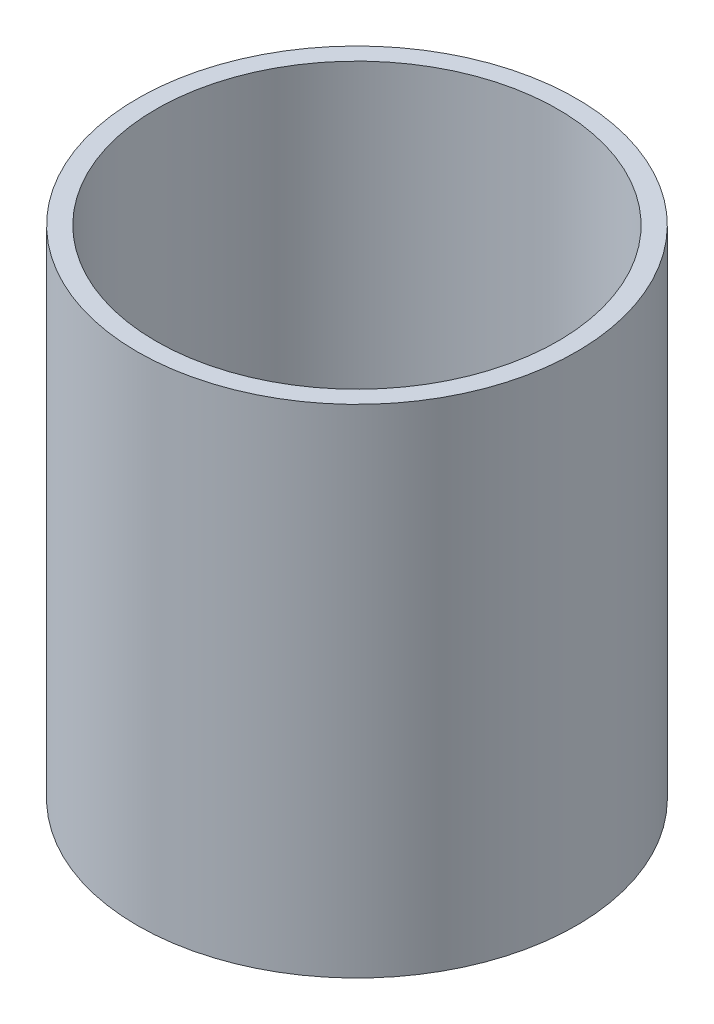
ISO-10303-21;
HEADER;
FILE_DESCRIPTION(('STEP AP214'),'2;1');
FILE_NAME('part.step','',(''),(''),'','','');
FILE_SCHEMA(('AUTOMOTIVE_DESIGN { 1 0 10303 214 1 1 1 1 }'));
ENDSEC;
DATA;
#1=APPLICATION_CONTEXT('core data for automotive mechanical design processes');
#2=APPLICATION_PROTOCOL_DEFINITION('international standard','automotive_design',2000,#1);
#3=PRODUCT_CONTEXT('',#1,'mechanical');
#4=PRODUCT('Part','Part','',(#3));
#5=PRODUCT_RELATED_PRODUCT_CATEGORY('part','',(#4));
#6=PRODUCT_DEFINITION_FORMATION('','',#4);
#7=PRODUCT_DEFINITION_CONTEXT('part definition',#1,'design');
#8=PRODUCT_DEFINITION('design','',#6,#7);
#9=PRODUCT_DEFINITION_SHAPE('','',#8);
#10=(LENGTH_UNIT() NAMED_UNIT(*) SI_UNIT(.MILLI.,.METRE.));
#11=(NAMED_UNIT(*) PLANE_ANGLE_UNIT() SI_UNIT($,.RADIAN.));
#12=(NAMED_UNIT(*) SI_UNIT($,.STERADIAN.) SOLID_ANGLE_UNIT());
#13=UNCERTAINTY_MEASURE_WITH_UNIT(LENGTH_MEASURE(1.E-05),#10,'distance_accuracy_value','');
#14=(GEOMETRIC_REPRESENTATION_CONTEXT(3) GLOBAL_UNCERTAINTY_ASSIGNED_CONTEXT((#13)) GLOBAL_UNIT_ASSIGNED_CONTEXT((#10,
#11,#12)) REPRESENTATION_CONTEXT('',''));
#15=CARTESIAN_POINT('',(0.,0.,0.));
#16=DIRECTION('',(0.,0.,1.));
#17=DIRECTION('',(1.,0.,0.));
#18=AXIS2_PLACEMENT_3D('',#15,#16,#17);
#19=CARTESIAN_POINT('',(0.,190.5,0.));
#20=DIRECTION('',(0.,1.,0.));
#21=DIRECTION('',(0.,0.,1.));
#22=AXIS2_PLACEMENT_3D('',#19,#20,#21);
#23=PLANE('',#22);
#24=CARTESIAN_POINT('',(0.,190.5,0.));
#25=DIRECTION('',(0.,1.,0.));
#26=DIRECTION('',(0.,0.,1.));
#27=AXIS2_PLACEMENT_3D('',#24,#25,#26);
#28=CIRCLE('',#27,84.15);
#29=CARTESIAN_POINT('',(0.,190.5,84.15));
#30=VERTEX_POINT('',#29);
#31=EDGE_CURVE('E10',#30,#30,#28,.T.);
#32=ORIENTED_EDGE('',*,*,#31,.T.);
#33=EDGE_LOOP('',(#32));
#34=FACE_BOUND('',#33,.T.);
#35=CARTESIAN_POINT('',(0.,190.5,0.));
#36=DIRECTION('',(0.,1.,0.));
#37=DIRECTION('',(0.,0.,1.));
#38=AXIS2_PLACEMENT_3D('',#35,#36,#37);
#39=CIRCLE('',#38,77.05);
#40=CARTESIAN_POINT('',(0.,190.5,77.05));
#41=VERTEX_POINT('',#40);
#42=EDGE_CURVE('E48',#41,#41,#39,.T.);
#43=ORIENTED_EDGE('',*,*,#42,.F.);
#44=EDGE_LOOP('',(#43));
#45=FACE_BOUND('',#44,.T.);
#46=ADVANCED_FACE('F37',(#34,#45),#23,.T.);
#47=CARTESIAN_POINT('',(0.,0.,0.));
#48=DIRECTION('',(0.,1.,0.));
#49=DIRECTION('',(0.,0.,1.));
#50=AXIS2_PLACEMENT_3D('',#47,#48,#49);
#51=PLANE('',#50);
#52=CARTESIAN_POINT('',(0.,0.,0.));
#53=DIRECTION('',(0.,1.,0.));
#54=DIRECTION('',(0.,0.,1.));
#55=AXIS2_PLACEMENT_3D('',#52,#53,#54);
#56=CIRCLE('',#55,84.15);
#57=CARTESIAN_POINT('',(0.,0.,84.15));
#58=VERTEX_POINT('',#57);
#59=EDGE_CURVE('E41',#58,#58,#56,.T.);
#60=ORIENTED_EDGE('',*,*,#59,.F.);
#61=EDGE_LOOP('',(#60));
#62=FACE_BOUND('',#61,.T.);
#63=CARTESIAN_POINT('',(0.,0.,0.));
#64=DIRECTION('',(0.,1.,0.));
#65=DIRECTION('',(0.,0.,1.));
#66=AXIS2_PLACEMENT_3D('',#63,#64,#65);
#67=CIRCLE('',#66,77.05);
#68=CARTESIAN_POINT('',(0.,0.,77.05));
#69=VERTEX_POINT('',#68);
#70=EDGE_CURVE('E50',#69,#69,#67,.T.);
#71=ORIENTED_EDGE('',*,*,#70,.T.);
#72=EDGE_LOOP('',(#71));
#73=FACE_BOUND('',#72,.T.);
#74=ADVANCED_FACE('F60',(#62,#73),#51,.F.);
#75=CARTESIAN_POINT('',(0.,190.5,0.));
#76=DIRECTION('',(0.,-1.,0.));
#77=DIRECTION('',(0.,0.,-1.));
#78=AXIS2_PLACEMENT_3D('',#75,#76,#77);
#79=CYLINDRICAL_SURFACE('',#78,84.15);
#80=ORIENTED_EDGE('',*,*,#31,.F.);
#81=EDGE_LOOP('',(#80));
#82=FACE_BOUND('',#81,.T.);
#83=ORIENTED_EDGE('',*,*,#59,.T.);
#84=EDGE_LOOP('',(#83));
#85=FACE_BOUND('',#84,.T.);
#86=ADVANCED_FACE('F39',(#82,#85),#79,.T.);
#87=CARTESIAN_POINT('',(0.,190.5,0.));
#88=DIRECTION('',(0.,-1.,0.));
#89=DIRECTION('',(0.,0.,-1.));
#90=AXIS2_PLACEMENT_3D('',#87,#88,#89);
#91=CYLINDRICAL_SURFACE('',#90,77.05);
#92=ORIENTED_EDGE('',*,*,#42,.T.);
#93=EDGE_LOOP('',(#92));
#94=FACE_BOUND('',#93,.T.);
#95=ORIENTED_EDGE('',*,*,#70,.F.);
#96=EDGE_LOOP('',(#95));
#97=FACE_BOUND('',#96,.T.);
#98=ADVANCED_FACE('F56',(#94,#97),#91,.F.);
#99=CLOSED_SHELL('',(#46,#74,#86,#98));
#100=MANIFOLD_SOLID_BREP('B2',#99);
#101=ADVANCED_BREP_SHAPE_REPRESENTATION('',(#18,#100),#14);
#102=SHAPE_DEFINITION_REPRESENTATION(#9,#101);
ENDSEC;
END-ISO-10303-21;
